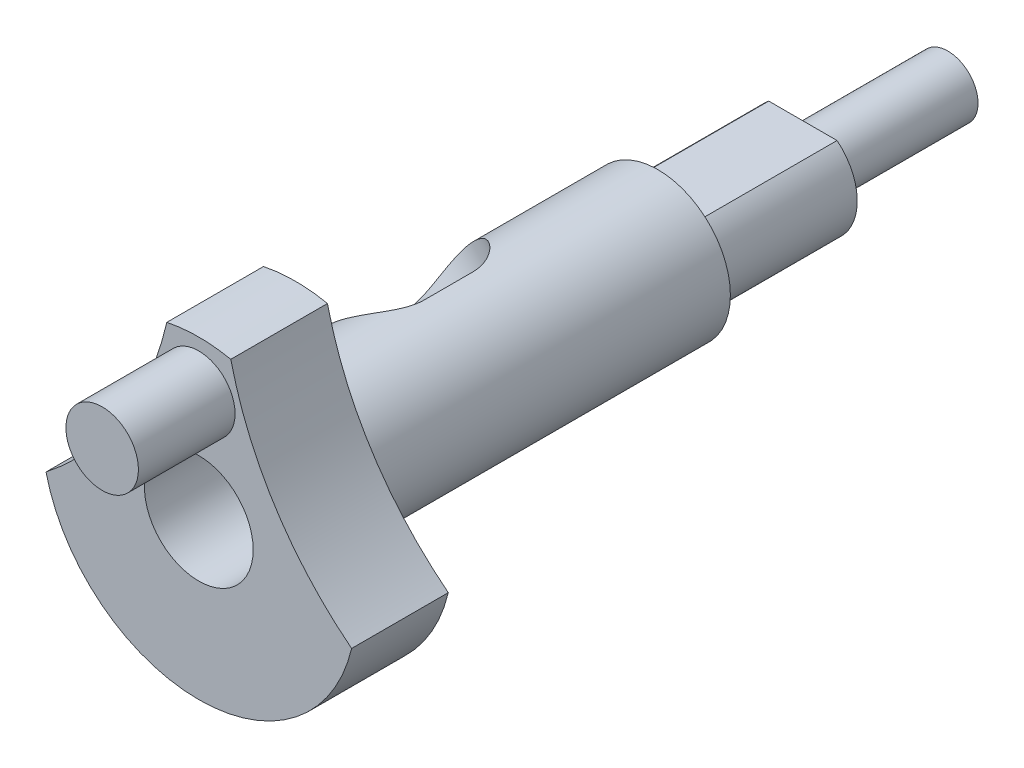
ISO-10303-21;
HEADER;
FILE_DESCRIPTION(('STEP AP214'),'2;1');
FILE_NAME('part.step','',(''),(''),'','','');
FILE_SCHEMA(('AUTOMOTIVE_DESIGN { 1 0 10303 214 1 1 1 1 }'));
ENDSEC;
DATA;
#1=APPLICATION_CONTEXT('core data for automotive mechanical design processes');
#2=APPLICATION_PROTOCOL_DEFINITION('international standard','automotive_design',2000,#1);
#3=PRODUCT_CONTEXT('',#1,'mechanical');
#4=PRODUCT('Part','Part','',(#3));
#5=PRODUCT_RELATED_PRODUCT_CATEGORY('part','',(#4));
#6=PRODUCT_DEFINITION_FORMATION('','',#4);
#7=PRODUCT_DEFINITION_CONTEXT('part definition',#1,'design');
#8=PRODUCT_DEFINITION('design','',#6,#7);
#9=PRODUCT_DEFINITION_SHAPE('','',#8);
#10=(LENGTH_UNIT() NAMED_UNIT(*) SI_UNIT(.MILLI.,.METRE.));
#11=(NAMED_UNIT(*) PLANE_ANGLE_UNIT() SI_UNIT($,.RADIAN.));
#12=(NAMED_UNIT(*) SI_UNIT($,.STERADIAN.) SOLID_ANGLE_UNIT());
#13=UNCERTAINTY_MEASURE_WITH_UNIT(LENGTH_MEASURE(1.E-05),#10,'distance_accuracy_value','');
#14=(GEOMETRIC_REPRESENTATION_CONTEXT(3) GLOBAL_UNCERTAINTY_ASSIGNED_CONTEXT((#13)) GLOBAL_UNIT_ASSIGNED_CONTEXT((#10,
#11,#12)) REPRESENTATION_CONTEXT('',''));
#15=CARTESIAN_POINT('',(0.,0.,0.));
#16=DIRECTION('',(0.,0.,1.));
#17=DIRECTION('',(1.,0.,0.));
#18=AXIS2_PLACEMENT_3D('',#15,#16,#17);
#19=CARTESIAN_POINT('',(0.,0.,38.));
#20=DIRECTION('',(0.,0.,-1.));
#21=DIRECTION('',(-1.,0.,0.));
#22=AXIS2_PLACEMENT_3D('',#19,#20,#21);
#23=CYLINDRICAL_SURFACE('',#22,6.);
#24=DIRECTION('',(0.,0.,-1.));
#25=VECTOR('',#24,1.);
#26=CARTESIAN_POINT('',(-5.99070478491457,0.333850535422231,38.));
#27=LINE('',#26,#25);
#28=CARTESIAN_POINT('',(-5.99070478491457,0.333850535422226,19.));
#29=VERTEX_POINT('',#28);
#30=CARTESIAN_POINT('',(-5.99070478491457,0.333850535422219,15.));
#31=VERTEX_POINT('',#30);
#32=EDGE_CURVE('E181',#29,#31,#27,.T.);
#33=ORIENTED_EDGE('',*,*,#32,.T.);
#34=CARTESIAN_POINT('',(-5.99070478491457,0.33385053542222,15.));
#35=CARTESIAN_POINT('',(-5.99068462384601,0.333794102484212,14.9016700694421));
#36=CARTESIAN_POINT('',(-5.99043392835748,0.338705679734013,14.803373809837));
#37=CARTESIAN_POINT('',(-5.98932261966602,0.358024435349374,14.6078499824939));
#38=CARTESIAN_POINT('',(-5.98846282369383,0.372418888719368,14.5106211598811));
#39=CARTESIAN_POINT('',(-5.98599743490155,0.410078400866928,14.3189160856903));
#40=CARTESIAN_POINT('',(-5.98439928518992,0.433254524490413,14.2244221397863));
#41=CARTESIAN_POINT('',(-5.98020314310197,0.487771412282417,14.0378468270955));
#42=CARTESIAN_POINT('',(-5.97760485980892,0.519114551197127,13.9457661706127));
#43=CARTESIAN_POINT('',(-5.96789076651244,0.623838637610835,13.6748967950068));
#44=CARTESIAN_POINT('',(-5.95884794145704,0.708157436176512,13.5003249059518));
#45=CARTESIAN_POINT('',(-5.93292407085201,0.899871896742307,13.164660993962));
#46=CARTESIAN_POINT('',(-5.91602063294133,1.00733301111156,13.003609042524));
#47=CARTESIAN_POINT('',(-5.86825416594927,1.25788232981635,12.6726721668229));
#48=CARTESIAN_POINT('',(-5.83563828537548,1.40390968032932,12.5052649498398));
#49=CARTESIAN_POINT('',(-5.75247114126858,1.71309527713194,12.1918872762063));
#50=CARTESIAN_POINT('',(-5.70191251112702,1.87626054019438,12.0459256591567));
#51=CARTESIAN_POINT('',(-5.60567811837211,2.14172586596341,11.8353387691972));
#52=CARTESIAN_POINT('',(-5.56713283544842,2.24027143049692,11.7625927007597));
#53=CARTESIAN_POINT('',(-5.4825252168611,2.44001242225565,11.6256347561315));
#54=CARTESIAN_POINT('',(-5.43646608759882,2.54120670379065,11.5614192607838));
#55=CARTESIAN_POINT('',(-5.33642982206874,2.74506927496129,11.4422602153109));
#56=CARTESIAN_POINT('',(-5.28245643410357,2.84773684617436,11.3873123022751));
#57=CARTESIAN_POINT('',(-5.16633968155836,3.05333591547656,11.2874500802822));
#58=CARTESIAN_POINT('',(-5.10419807251795,3.15626735220721,11.2425336209168));
#59=CARTESIAN_POINT('',(-4.97918147802601,3.34954870284617,11.1679527379798));
#60=CARTESIAN_POINT('',(-4.91716969499483,3.44001545956048,11.1371429666341));
#61=CARTESIAN_POINT('',(-4.78692038727476,3.61906632763843,11.084556090231));
#62=CARTESIAN_POINT('',(-4.7186840853636,3.70765080456955,11.0627772157379));
#63=CARTESIAN_POINT('',(-4.57646107465812,3.88183379595727,11.0286602692173));
#64=CARTESIAN_POINT('',(-4.50248013883438,3.9674351859929,11.0163128510814));
#65=CARTESIAN_POINT('',(-4.34933158770849,4.13475150400611,11.0012670175454));
#66=CARTESIAN_POINT('',(-4.27016470582344,4.21646697873617,10.9985672407247));
#67=CARTESIAN_POINT('',(-4.11986475751268,4.36302616137143,11.0025359831951));
#68=CARTESIAN_POINT('',(-4.04934667428559,4.42854291014055,11.0078391464272));
#69=CARTESIAN_POINT('',(-3.90570457662103,4.55572999286147,11.0253326644031));
#70=CARTESIAN_POINT('',(-3.83257980541936,4.61739919527942,11.0375250347069));
#71=CARTESIAN_POINT('',(-3.68437622852754,4.73649689078476,11.0686276380302));
#72=CARTESIAN_POINT('',(-3.60929809605171,4.79392681940027,11.0875355842599));
#73=CARTESIAN_POINT('',(-3.45777879317312,4.90434231773574,11.1318208891128));
#74=CARTESIAN_POINT('',(-3.38133710491112,4.95732615335596,11.1572007565209));
#75=CARTESIAN_POINT('',(-3.1515803017739,5.10891450582079,11.2423705436646));
#76=CARTESIAN_POINT('',(-2.99708244893249,5.20075288103304,11.3113512975243));
#77=CARTESIAN_POINT('',(-2.68981265509196,5.36613995064513,11.4711137268256));
#78=CARTESIAN_POINT('',(-2.53704103484302,5.43968529768881,11.5618993862802));
#79=CARTESIAN_POINT('',(-2.21735018226009,5.57830992876048,11.7759534369368));
#80=CARTESIAN_POINT('',(-2.05121030998877,5.64100629163019,11.901922758987));
#81=CARTESIAN_POINT('',(-1.73099638294765,5.7473611340493,12.1758175657317));
#82=CARTESIAN_POINT('',(-1.57694114843918,5.79099038376687,12.3237762981113));
#83=CARTESIAN_POINT('',(-1.34787815689185,5.84728203701133,12.5727700828312));
#84=CARTESIAN_POINT('',(-1.26694706940593,5.86524278605991,12.6672579482261));
#85=CARTESIAN_POINT('',(-1.1121464587109,5.89655614056708,12.8625720649592));
#86=CARTESIAN_POINT('',(-1.03827858805236,5.90990766952429,12.9633997905053));
#87=CARTESIAN_POINT('',(-0.829423409196999,5.94406029413866,13.2747973576292));
#88=CARTESIAN_POINT('',(-0.706770717927883,5.95905148321317,13.4947201963963));
#89=CARTESIAN_POINT('',(-0.53587236557008,5.97646414038617,13.8907212733341));
#90=CARTESIAN_POINT('',(-0.476409046988667,5.9812295733466,14.0618387549338));
#91=CARTESIAN_POINT('',(-0.409191403767886,5.98607049220323,14.3238865733191));
#92=CARTESIAN_POINT('',(-0.390456555168995,5.98729950957404,14.4120361908501));
#93=CARTESIAN_POINT('',(-0.360741262689207,5.98916498689055,14.5896181690323));
#94=CARTESIAN_POINT('',(-0.349755973150613,5.9898018171994,14.6790496923692));
#95=CARTESIAN_POINT('',(-0.339824020492703,5.99036941518117,14.8072383792669));
#96=CARTESIAN_POINT('',(-0.33758504877755,5.99049570796023,14.8457629168698));
#97=CARTESIAN_POINT('',(-0.334598422532334,5.99066322707905,14.9228564849096));
#98=CARTESIAN_POINT('',(-0.333850249468071,5.99070448299677,14.9614254952058));
#99=CARTESIAN_POINT('',(-0.333850535422159,5.99070478491457,15.));
#100=B_SPLINE_CURVE_WITH_KNOTS('',3,(#34,#35,#36,#37,#38,#39,#40,#41,#42,#43,#44,#45,#46,#47,
#48,#49,#50,#51,#52,#53,#54,#55,#56,#57,#58,#59,#60,#61,#62,#63,#64,#65,#66,#67,#68,#69,#70,#71,
#72,#73,#74,#75,#76,#77,#78,#79,#80,#81,#82,#83,#84,#85,#86,#87,#88,#89,#90,#91,#92,#93,#94,#95,
#96,#97,#98,#99),.UNSPECIFIED.,.F.,.F.,(4,2,2,2,2,2,2,2,2,2,2,2,2,2,2,2,2,2,2,2,2,2,2,2,2,2,2,2,
2,2,2,2,4),(0.,0.294812601374015,0.589230399700308,0.88074293705704,1.17234033311452,
1.75203722892106,2.33339570715297,3.00454638680601,3.67597293470638,4.06075015246325,
4.44536360079123,4.82979547572238,5.21414486203719,5.55540621902153,5.89660068058384,
6.23745659503621,6.57826440792967,6.86711986515746,7.15605987596875,7.4449015910287,
7.73385544376988,8.30887925814426,8.88400821617185,9.53472255750196,10.1864309725428,
10.563119297333,10.9398955397299,11.6916405518195,12.2329415710687,12.5030281277052,
12.7729456541035,12.8886912839471,13.004396647755),.UNSPECIFIED.);
#101=CARTESIAN_POINT('',(-0.333850535422156,5.99070478491457,15.));
#102=VERTEX_POINT('',#101);
#103=EDGE_CURVE('E257',#31,#102,#100,.T.);
#104=ORIENTED_EDGE('',*,*,#103,.T.);
#105=DIRECTION('',(0.,0.,-1.));
#106=VECTOR('',#105,1.);
#107=CARTESIAN_POINT('',(-0.333850535422155,5.99070478491457,38.));
#108=LINE('',#107,#106);
#109=CARTESIAN_POINT('',(-0.333850535422155,5.99070478491457,19.));
#110=VERTEX_POINT('',#109);
#111=EDGE_CURVE('E358',#102,#110,#108,.F.);
#112=ORIENTED_EDGE('',*,*,#111,.T.);
#113=CARTESIAN_POINT('',(-0.333850535422159,5.99070478491457,19.));
#114=CARTESIAN_POINT('',(-0.333794102484151,5.99068462384602,19.098329930558));
#115=CARTESIAN_POINT('',(-0.338705679733952,5.99043392835748,19.196626190163));
#116=CARTESIAN_POINT('',(-0.358024435349313,5.98932261966602,19.3921500175061));
#117=CARTESIAN_POINT('',(-0.372418888719307,5.98846282369383,19.489378840119));
#118=CARTESIAN_POINT('',(-0.410078400866868,5.98599743490155,19.6810839143097));
#119=CARTESIAN_POINT('',(-0.433254524490353,5.98439928518993,19.7755778602137));
#120=CARTESIAN_POINT('',(-0.487771412282356,5.98020314310197,19.9621531729045));
#121=CARTESIAN_POINT('',(-0.519114551197065,5.97760485980892,20.0542338293873));
#122=CARTESIAN_POINT('',(-0.623838637610773,5.96789076651244,20.3251032049932));
#123=CARTESIAN_POINT('',(-0.70815743617645,5.95884794145705,20.4996750940482));
#124=CARTESIAN_POINT('',(-0.899871896742246,5.93292407085202,20.835339006038));
#125=CARTESIAN_POINT('',(-1.0073330111115,5.91602063294134,20.996390957476));
#126=CARTESIAN_POINT('',(-1.25788232981629,5.86825416594928,21.3273278331771));
#127=CARTESIAN_POINT('',(-1.40390968032926,5.83563828537549,21.4947350501602));
#128=CARTESIAN_POINT('',(-1.71309527713188,5.7524711412686,21.8081127237937));
#129=CARTESIAN_POINT('',(-1.87626054019432,5.70191251112704,21.9540743408433));
#130=CARTESIAN_POINT('',(-2.14172586596335,5.60567811837214,22.1646612308028));
#131=CARTESIAN_POINT('',(-2.24027143049686,5.56713283544844,22.2374072992403));
#132=CARTESIAN_POINT('',(-2.4400124222556,5.48252521686113,22.3743652438686));
#133=CARTESIAN_POINT('',(-2.54120670379059,5.43646608759884,22.4385807392162));
#134=CARTESIAN_POINT('',(-2.74506927496124,5.33642982206877,22.5577397846892));
#135=CARTESIAN_POINT('',(-2.8477368461743,5.2824564341036,22.612687697725));
#136=CARTESIAN_POINT('',(-3.05333591547651,5.1663396815584,22.7125499197178));
#137=CARTESIAN_POINT('',(-3.15626735220716,5.10419807251798,22.7574663790832));
#138=CARTESIAN_POINT('',(-3.34954870284612,4.97918147802605,22.8320472620202));
#139=CARTESIAN_POINT('',(-3.44001545956042,4.91716969499487,22.8628570333659));
#140=CARTESIAN_POINT('',(-3.61906632763837,4.7869203872748,22.915443909769));
#141=CARTESIAN_POINT('',(-3.7076508045695,4.71868408536364,22.9372227842621));
#142=CARTESIAN_POINT('',(-3.88183379595722,4.57646107465816,22.9713397307827));
#143=CARTESIAN_POINT('',(-3.96743518599285,4.50248013883443,22.9836871489186));
#144=CARTESIAN_POINT('',(-4.13475150400607,4.34933158770854,22.9987329824546));
#145=CARTESIAN_POINT('',(-4.21646697873612,4.27016470582349,23.0014327592753));
#146=CARTESIAN_POINT('',(-4.36302616137139,4.11986475751273,22.9974640168049));
#147=CARTESIAN_POINT('',(-4.42854291014051,4.04934667428564,22.9921608535728));
#148=CARTESIAN_POINT('',(-4.55572999286143,3.90570457662107,22.9746673355969));
#149=CARTESIAN_POINT('',(-4.61739919527938,3.83257980541941,22.9624749652931));
#150=CARTESIAN_POINT('',(-4.73649689078472,3.68437622852759,22.9313723619698));
#151=CARTESIAN_POINT('',(-4.79392681940023,3.60929809605176,22.9124644157401));
#152=CARTESIAN_POINT('',(-4.9043423177357,3.45777879317317,22.8681791108872));
#153=CARTESIAN_POINT('',(-4.95732615335593,3.38133710491117,22.8427992434791));
#154=CARTESIAN_POINT('',(-5.10891450582076,3.15158030177396,22.7576294563355));
#155=CARTESIAN_POINT('',(-5.20075288103301,2.99708244893255,22.6886487024757));
#156=CARTESIAN_POINT('',(-5.3661399506451,2.68981265509202,22.5288862731744));
#157=CARTESIAN_POINT('',(-5.43968529768879,2.53704103484308,22.4381006137198));
#158=CARTESIAN_POINT('',(-5.57830992876045,2.21735018226015,22.2240465630632));
#159=CARTESIAN_POINT('',(-5.64100629163017,2.05121030998883,22.098077241013));
#160=CARTESIAN_POINT('',(-5.74736113404928,1.73099638294771,21.8241824342683));
#161=CARTESIAN_POINT('',(-5.79099038376686,1.57694114843924,21.6762237018887));
#162=CARTESIAN_POINT('',(-5.84728203701131,1.34787815689192,21.4272299171688));
#163=CARTESIAN_POINT('',(-5.86524278605989,1.26694706940599,21.3327420517739));
#164=CARTESIAN_POINT('',(-5.89655614056707,1.11214645871096,21.1374279350408));
#165=CARTESIAN_POINT('',(-5.90990766952428,1.03827858805242,21.0366002094948));
#166=CARTESIAN_POINT('',(-5.94406029413865,0.829423409197063,20.7252026423708));
#167=CARTESIAN_POINT('',(-5.95905148321316,0.706770717927947,20.5052798036037));
#168=CARTESIAN_POINT('',(-5.97646414038616,0.535872365570145,20.1092787266659));
#169=CARTESIAN_POINT('',(-5.98122957334659,0.476409046988732,19.9381612450662));
#170=CARTESIAN_POINT('',(-5.98607049220323,0.40919140376795,19.6761134266809));
#171=CARTESIAN_POINT('',(-5.98729950957404,0.390456555169059,19.5879638091499));
#172=CARTESIAN_POINT('',(-5.98916498689055,0.360741262689271,19.4103818309677));
#173=CARTESIAN_POINT('',(-5.9898018171994,0.349755973150676,19.3209503076308));
#174=CARTESIAN_POINT('',(-5.99036941518117,0.339824020492767,19.1927616207331));
#175=CARTESIAN_POINT('',(-5.99049570796022,0.337585048777614,19.1542370831302));
#176=CARTESIAN_POINT('',(-5.99066322707904,0.334598422532398,19.0771435150904));
#177=CARTESIAN_POINT('',(-5.99070448299677,0.333850249468135,19.0385745047942));
#178=CARTESIAN_POINT('',(-5.99070478491457,0.333850535422222,19.));
#179=B_SPLINE_CURVE_WITH_KNOTS('',3,(#113,#114,#115,#116,#117,#118,#119,#120,#121,#122,#123,
#124,#125,#126,#127,#128,#129,#130,#131,#132,#133,#134,#135,#136,#137,#138,#139,#140,#141,#142,
#143,#144,#145,#146,#147,#148,#149,#150,#151,#152,#153,#154,#155,#156,#157,#158,#159,#160,#161,
#162,#163,#164,#165,#166,#167,#168,#169,#170,#171,#172,#173,#174,#175,#176,#177,#178),
.UNSPECIFIED.,.F.,.F.,(4,2,2,2,2,2,2,2,2,2,2,2,2,2,2,2,2,2,2,2,2,2,2,2,2,2,2,2,2,2,2,2,4),(0.,
0.294812601374016,0.589230399700311,0.88074293705704,1.17234033311452,1.75203722892105,
2.33339570715297,3.00454638680601,3.67597293470638,4.06075015246325,4.44536360079123,
4.82979547572238,5.21414486203718,5.55540621902153,5.89660068058383,6.23745659503621,
6.57826440792966,6.86711986515746,7.15605987596875,7.4449015910287,7.73385544376987,
8.30887925814425,8.88400821617184,9.53472255750196,10.1864309725428,10.563119297333,
10.9398955397299,11.6916405518195,12.2329415710687,12.5030281277052,12.7729456541035,
12.8886912839471,13.004396647755),.UNSPECIFIED.);
#180=EDGE_CURVE('E173',#110,#29,#179,.T.);
#181=ORIENTED_EDGE('',*,*,#180,.T.);
#182=EDGE_LOOP('',(#33,#104,#112,#181));
#183=FACE_BOUND('',#182,.T.);
#184=CARTESIAN_POINT('',(0.,0.,0.));
#185=DIRECTION('',(0.,0.,1.));
#186=DIRECTION('',(1.,0.,0.));
#187=AXIS2_PLACEMENT_3D('',#184,#185,#186);
#188=CIRCLE('',#187,6.);
#189=CARTESIAN_POINT('',(6.,0.,0.));
#190=VERTEX_POINT('',#189);
#191=EDGE_CURVE('E138',#190,#190,#188,.T.);
#192=ORIENTED_EDGE('',*,*,#191,.T.);
#193=EDGE_LOOP('',(#192));
#194=FACE_BOUND('',#193,.T.);
#195=CARTESIAN_POINT('',(0.,0.,30.));
#196=DIRECTION('',(0.,0.,1.));
#197=DIRECTION('',(1.,0.,0.));
#198=AXIS2_PLACEMENT_3D('',#195,#196,#197);
#199=CIRCLE('',#198,6.);
#200=CARTESIAN_POINT('',(6.,0.,30.));
#201=VERTEX_POINT('',#200);
#202=EDGE_CURVE('E137',#201,#201,#199,.T.);
#203=ORIENTED_EDGE('',*,*,#202,.F.);
#204=EDGE_LOOP('',(#203));
#205=FACE_BOUND('',#204,.T.);
#206=ADVANCED_FACE('F43',(#183,#194,#205),#23,.T.);
#207=CARTESIAN_POINT('',(0.,0.,0.));
#208=DIRECTION('',(0.,0.,1.));
#209=DIRECTION('',(1.,0.,0.));
#210=AXIS2_PLACEMENT_3D('',#207,#208,#209);
#211=PLANE('',#210);
#212=DIRECTION('',(1.,0.,0.));
#213=VECTOR('',#212,1.);
#214=CARTESIAN_POINT('',(-3.5,3.5,0.));
#215=LINE('',#214,#213);
#216=CARTESIAN_POINT('',(-2.82842712474619,3.5,0.));
#217=VERTEX_POINT('',#216);
#218=CARTESIAN_POINT('',(2.82842712474619,3.5,0.));
#219=VERTEX_POINT('',#218);
#220=EDGE_CURVE('E124',#217,#219,#215,.T.);
#221=ORIENTED_EDGE('',*,*,#220,.F.);
#222=CARTESIAN_POINT('',(0.,0.,0.));
#223=DIRECTION('',(0.,0.,1.));
#224=DIRECTION('',(1.,0.,0.));
#225=AXIS2_PLACEMENT_3D('',#222,#223,#224);
#226=CIRCLE('',#225,4.5);
#227=EDGE_CURVE('E134',#219,#217,#226,.F.);
#228=ORIENTED_EDGE('',*,*,#227,.F.);
#229=EDGE_LOOP('',(#221,#228));
#230=FACE_BOUND('',#229,.T.);
#231=ORIENTED_EDGE('',*,*,#191,.F.);
#232=EDGE_LOOP('',(#231));
#233=FACE_BOUND('',#232,.T.);
#234=ADVANCED_FACE('F132',(#230,#233),#211,.F.);
#235=CARTESIAN_POINT('',(0.,0.,-12.));
#236=DIRECTION('',(0.,0.,1.));
#237=DIRECTION('',(1.,0.,0.));
#238=AXIS2_PLACEMENT_3D('',#235,#236,#237);
#239=CYLINDRICAL_SURFACE('',#238,4.5);
#240=CARTESIAN_POINT('',(0.,0.,-12.));
#241=DIRECTION('',(0.,0.,-1.));
#242=DIRECTION('',(-1.,0.,0.));
#243=AXIS2_PLACEMENT_3D('',#240,#241,#242);
#244=CIRCLE('',#243,4.5);
#245=CARTESIAN_POINT('',(2.82842712474619,3.5,-12.));
#246=VERTEX_POINT('',#245);
#247=CARTESIAN_POINT('',(-2.82842712474619,3.5,-12.));
#248=VERTEX_POINT('',#247);
#249=EDGE_CURVE('E144',#246,#248,#244,.T.);
#250=ORIENTED_EDGE('',*,*,#249,.F.);
#251=DIRECTION('',(0.,0.,1.));
#252=VECTOR('',#251,1.);
#253=CARTESIAN_POINT('',(2.82842712474619,3.5,-12.));
#254=LINE('',#253,#252);
#255=EDGE_CURVE('E57',#246,#219,#254,.T.);
#256=ORIENTED_EDGE('',*,*,#255,.T.);
#257=ORIENTED_EDGE('',*,*,#227,.T.);
#258=DIRECTION('',(0.,0.,1.));
#259=VECTOR('',#258,1.);
#260=CARTESIAN_POINT('',(-2.82842712474619,3.5,-12.));
#261=LINE('',#260,#259);
#262=EDGE_CURVE('E121',#217,#248,#261,.F.);
#263=ORIENTED_EDGE('',*,*,#262,.T.);
#264=EDGE_LOOP('',(#250,#256,#257,#263));
#265=FACE_BOUND('',#264,.T.);
#266=ADVANCED_FACE('F136',(#265),#239,.T.);
#267=CARTESIAN_POINT('',(0.,0.,-12.));
#268=DIRECTION('',(0.,0.,-1.));
#269=DIRECTION('',(-1.,0.,0.));
#270=AXIS2_PLACEMENT_3D('',#267,#268,#269);
#271=PLANE('',#270);
#272=DIRECTION('',(-1.,0.,0.));
#273=VECTOR('',#272,1.);
#274=CARTESIAN_POINT('',(0.,3.5,-12.));
#275=LINE('',#274,#273);
#276=EDGE_CURVE('E11',#246,#248,#275,.T.);
#277=ORIENTED_EDGE('',*,*,#276,.F.);
#278=ORIENTED_EDGE('',*,*,#249,.T.);
#279=EDGE_LOOP('',(#277,#278));
#280=FACE_BOUND('',#279,.T.);
#281=CARTESIAN_POINT('',(0.,0.,-12.));
#282=DIRECTION('',(0.,0.,-1.));
#283=DIRECTION('',(-1.,0.,0.));
#284=AXIS2_PLACEMENT_3D('',#281,#282,#283);
#285=CIRCLE('',#284,2.5);
#286=CARTESIAN_POINT('',(-2.5,0.,-12.));
#287=VERTEX_POINT('',#286);
#288=EDGE_CURVE('E231',#287,#287,#285,.T.);
#289=ORIENTED_EDGE('',*,*,#288,.F.);
#290=EDGE_LOOP('',(#289));
#291=FACE_BOUND('',#290,.T.);
#292=ADVANCED_FACE('F224',(#280,#291),#271,.T.);
#293=CARTESIAN_POINT('',(-29.9303086058866,19.0308918767969,30.));
#294=DIRECTION('',(0.,0.,1.));
#295=DIRECTION('',(1.,0.,0.));
#296=AXIS2_PLACEMENT_3D('',#293,#294,#295);
#297=CYLINDRICAL_SURFACE('',#296,28.);
#298=CARTESIAN_POINT('',(-29.9303086058866,19.0308918767969,38.));
#299=DIRECTION('',(0.,0.,1.));
#300=DIRECTION('',(1.,0.,0.));
#301=AXIS2_PLACEMENT_3D('',#298,#299,#300);
#302=CIRCLE('',#301,28.);
#303=CARTESIAN_POINT('',(-12.6491106406735,-3.,38.));
#304=VERTEX_POINT('',#303);
#305=CARTESIAN_POINT('',(-2.64911064067352,12.7272232954981,38.));
#306=VERTEX_POINT('',#305);
#307=EDGE_CURVE('E192',#304,#306,#302,.T.);
#308=ORIENTED_EDGE('',*,*,#307,.T.);
#309=DIRECTION('',(0.,0.,1.));
#310=VECTOR('',#309,1.);
#311=CARTESIAN_POINT('',(-2.64911064067352,12.7272232954981,30.));
#312=LINE('',#311,#310);
#313=CARTESIAN_POINT('',(-2.64911064067352,12.7272232954981,30.));
#314=VERTEX_POINT('',#313);
#315=EDGE_CURVE('E222',#314,#306,#312,.T.);
#316=ORIENTED_EDGE('',*,*,#315,.F.);
#317=CARTESIAN_POINT('',(-29.9303086058866,19.0308918767969,30.));
#318=DIRECTION('',(0.,0.,1.));
#319=DIRECTION('',(1.,0.,0.));
#320=AXIS2_PLACEMENT_3D('',#317,#318,#319);
#321=CIRCLE('',#320,28.);
#322=CARTESIAN_POINT('',(-12.6491106406735,-3.,30.));
#323=VERTEX_POINT('',#322);
#324=EDGE_CURVE('E195',#323,#314,#321,.T.);
#325=ORIENTED_EDGE('',*,*,#324,.F.);
#326=DIRECTION('',(0.,0.,1.));
#327=VECTOR('',#326,1.);
#328=CARTESIAN_POINT('',(-12.6491106406735,-3.,30.));
#329=LINE('',#328,#327);
#330=EDGE_CURVE('E206',#323,#304,#329,.T.);
#331=ORIENTED_EDGE('',*,*,#330,.T.);
#332=EDGE_LOOP('',(#308,#316,#325,#331));
#333=FACE_BOUND('',#332,.T.);
#334=ADVANCED_FACE('F227',(#333),#297,.F.);
#335=CARTESIAN_POINT('',(0.,0.,30.));
#336=DIRECTION('',(0.,0.,1.));
#337=DIRECTION('',(1.,0.,0.));
#338=AXIS2_PLACEMENT_3D('',#335,#336,#337);
#339=CYLINDRICAL_SURFACE('',#338,13.);
#340=CARTESIAN_POINT('',(0.,0.,38.));
#341=DIRECTION('',(0.,0.,1.));
#342=DIRECTION('',(1.,0.,0.));
#343=AXIS2_PLACEMENT_3D('',#340,#341,#342);
#344=CIRCLE('',#343,13.);
#345=CARTESIAN_POINT('',(2.64911064067352,12.7272232954981,38.));
#346=VERTEX_POINT('',#345);
#347=EDGE_CURVE('E209',#346,#306,#344,.T.);
#348=ORIENTED_EDGE('',*,*,#347,.F.);
#349=DIRECTION('',(0.,0.,1.));
#350=VECTOR('',#349,1.);
#351=CARTESIAN_POINT('',(2.64911064067352,12.7272232954981,30.));
#352=LINE('',#351,#350);
#353=CARTESIAN_POINT('',(2.64911064067352,12.7272232954981,30.));
#354=VERTEX_POINT('',#353);
#355=EDGE_CURVE('E220',#354,#346,#352,.T.);
#356=ORIENTED_EDGE('',*,*,#355,.F.);
#357=CARTESIAN_POINT('',(0.,0.,30.));
#358=DIRECTION('',(0.,0.,1.));
#359=DIRECTION('',(1.,0.,0.));
#360=AXIS2_PLACEMENT_3D('',#357,#358,#359);
#361=CIRCLE('',#360,13.);
#362=EDGE_CURVE('E197',#354,#314,#361,.T.);
#363=ORIENTED_EDGE('',*,*,#362,.T.);
#364=ORIENTED_EDGE('',*,*,#315,.T.);
#365=EDGE_LOOP('',(#348,#356,#363,#364));
#366=FACE_BOUND('',#365,.T.);
#367=ADVANCED_FACE('F310',(#366),#339,.T.);
#368=CARTESIAN_POINT('',(29.9303086058866,19.0308918767969,30.));
#369=DIRECTION('',(0.,0.,1.));
#370=DIRECTION('',(1.,0.,0.));
#371=AXIS2_PLACEMENT_3D('',#368,#369,#370);
#372=CYLINDRICAL_SURFACE('',#371,28.);
#373=CARTESIAN_POINT('',(29.9303086058866,19.0308918767969,38.));
#374=DIRECTION('',(0.,0.,1.));
#375=DIRECTION('',(1.,0.,0.));
#376=AXIS2_PLACEMENT_3D('',#373,#374,#375);
#377=CIRCLE('',#376,28.);
#378=CARTESIAN_POINT('',(12.6491106406735,-3.,38.));
#379=VERTEX_POINT('',#378);
#380=EDGE_CURVE('E212',#346,#379,#377,.T.);
#381=ORIENTED_EDGE('',*,*,#380,.T.);
#382=DIRECTION('',(0.,0.,1.));
#383=VECTOR('',#382,1.);
#384=CARTESIAN_POINT('',(12.6491106406735,-3.,30.));
#385=LINE('',#384,#383);
#386=CARTESIAN_POINT('',(12.6491106406735,-3.,30.));
#387=VERTEX_POINT('',#386);
#388=EDGE_CURVE('E218',#387,#379,#385,.T.);
#389=ORIENTED_EDGE('',*,*,#388,.F.);
#390=CARTESIAN_POINT('',(29.9303086058866,19.0308918767969,30.));
#391=DIRECTION('',(0.,0.,1.));
#392=DIRECTION('',(1.,0.,0.));
#393=AXIS2_PLACEMENT_3D('',#390,#391,#392);
#394=CIRCLE('',#393,28.);
#395=EDGE_CURVE('E201',#354,#387,#394,.T.);
#396=ORIENTED_EDGE('',*,*,#395,.F.);
#397=ORIENTED_EDGE('',*,*,#355,.T.);
#398=EDGE_LOOP('',(#381,#389,#396,#397));
#399=FACE_BOUND('',#398,.T.);
#400=ADVANCED_FACE('F315',(#399),#372,.F.);
#401=CARTESIAN_POINT('',(0.,0.,30.));
#402=DIRECTION('',(0.,0.,1.));
#403=DIRECTION('',(1.,0.,0.));
#404=AXIS2_PLACEMENT_3D('',#401,#402,#403);
#405=CYLINDRICAL_SURFACE('',#404,13.);
#406=CARTESIAN_POINT('',(0.,0.,38.));
#407=DIRECTION('',(0.,0.,1.));
#408=DIRECTION('',(1.,0.,0.));
#409=AXIS2_PLACEMENT_3D('',#406,#407,#408);
#410=CIRCLE('',#409,13.);
#411=EDGE_CURVE('E198',#304,#379,#410,.T.);
#412=ORIENTED_EDGE('',*,*,#411,.F.);
#413=ORIENTED_EDGE('',*,*,#330,.F.);
#414=CARTESIAN_POINT('',(0.,0.,30.));
#415=DIRECTION('',(0.,0.,1.));
#416=DIRECTION('',(1.,0.,0.));
#417=AXIS2_PLACEMENT_3D('',#414,#415,#416);
#418=CIRCLE('',#417,13.);
#419=EDGE_CURVE('E203',#323,#387,#418,.T.);
#420=ORIENTED_EDGE('',*,*,#419,.T.);
#421=ORIENTED_EDGE('',*,*,#388,.T.);
#422=EDGE_LOOP('',(#412,#413,#420,#421));
#423=FACE_BOUND('',#422,.T.);
#424=ADVANCED_FACE('F300',(#423),#405,.T.);
#425=CARTESIAN_POINT('',(-14.9651543029433,9.51544593839844,30.));
#426=DIRECTION('',(0.,0.,1.));
#427=DIRECTION('',(1.,0.,0.));
#428=AXIS2_PLACEMENT_3D('',#425,#426,#427);
#429=PLANE('',#428);
#430=ORIENTED_EDGE('',*,*,#202,.T.);
#431=EDGE_LOOP('',(#430));
#432=FACE_BOUND('',#431,.T.);
#433=ORIENTED_EDGE('',*,*,#324,.T.);
#434=ORIENTED_EDGE('',*,*,#362,.F.);
#435=ORIENTED_EDGE('',*,*,#395,.T.);
#436=ORIENTED_EDGE('',*,*,#419,.F.);
#437=EDGE_LOOP('',(#433,#434,#435,#436));
#438=FACE_BOUND('',#437,.T.);
#439=ADVANCED_FACE('F296',(#432,#438),#429,.F.);
#440=CARTESIAN_POINT('',(0.,0.,38.));
#441=DIRECTION('',(0.,0.,1.));
#442=DIRECTION('',(1.,0.,0.));
#443=AXIS2_PLACEMENT_3D('',#440,#441,#442);
#444=PLANE('',#443);
#445=CARTESIAN_POINT('',(0.,0.,38.));
#446=DIRECTION('',(0.,0.,1.));
#447=DIRECTION('',(1.,0.,0.));
#448=AXIS2_PLACEMENT_3D('',#445,#446,#447);
#449=CIRCLE('',#448,4.5);
#450=CARTESIAN_POINT('',(4.5,0.,38.));
#451=VERTEX_POINT('',#450);
#452=EDGE_CURVE('E180',#451,#451,#449,.T.);
#453=ORIENTED_EDGE('',*,*,#452,.F.);
#454=EDGE_LOOP('',(#453));
#455=FACE_BOUND('',#454,.T.);
#456=CARTESIAN_POINT('',(0.,9.,38.));
#457=DIRECTION('',(0.,0.,1.));
#458=DIRECTION('',(1.,0.,0.));
#459=AXIS2_PLACEMENT_3D('',#456,#457,#458);
#460=CIRCLE('',#459,3.);
#461=CARTESIAN_POINT('',(3.,9.,38.));
#462=VERTEX_POINT('',#461);
#463=EDGE_CURVE('E186',#462,#462,#460,.T.);
#464=ORIENTED_EDGE('',*,*,#463,.F.);
#465=EDGE_LOOP('',(#464));
#466=FACE_BOUND('',#465,.T.);
#467=ORIENTED_EDGE('',*,*,#307,.F.);
#468=ORIENTED_EDGE('',*,*,#411,.T.);
#469=ORIENTED_EDGE('',*,*,#380,.F.);
#470=ORIENTED_EDGE('',*,*,#347,.T.);
#471=EDGE_LOOP('',(#467,#468,#469,#470));
#472=FACE_BOUND('',#471,.T.);
#473=ADVANCED_FACE('F299',(#455,#466,#472),#444,.T.);
#474=CARTESIAN_POINT('',(0.,9.,46.));
#475=DIRECTION('',(0.,0.,-1.));
#476=DIRECTION('',(-1.,0.,0.));
#477=AXIS2_PLACEMENT_3D('',#474,#475,#476);
#478=CYLINDRICAL_SURFACE('',#477,3.);
#479=CARTESIAN_POINT('',(0.,9.,46.));
#480=DIRECTION('',(0.,0.,1.));
#481=DIRECTION('',(1.,0.,0.));
#482=AXIS2_PLACEMENT_3D('',#479,#480,#481);
#483=CIRCLE('',#482,3.);
#484=CARTESIAN_POINT('',(3.,9.,46.));
#485=VERTEX_POINT('',#484);
#486=EDGE_CURVE('E189',#485,#485,#483,.T.);
#487=ORIENTED_EDGE('',*,*,#486,.F.);
#488=EDGE_LOOP('',(#487));
#489=FACE_BOUND('',#488,.T.);
#490=ORIENTED_EDGE('',*,*,#463,.T.);
#491=EDGE_LOOP('',(#490));
#492=FACE_BOUND('',#491,.T.);
#493=ADVANCED_FACE('F319',(#489,#492),#478,.T.);
#494=CARTESIAN_POINT('',(0.,9.,46.));
#495=DIRECTION('',(0.,0.,1.));
#496=DIRECTION('',(1.,0.,0.));
#497=AXIS2_PLACEMENT_3D('',#494,#495,#496);
#498=PLANE('',#497);
#499=ORIENTED_EDGE('',*,*,#486,.T.);
#500=EDGE_LOOP('',(#499));
#501=FACE_BOUND('',#500,.T.);
#502=ADVANCED_FACE('F326',(#501),#498,.T.);
#503=CARTESIAN_POINT('',(0.,0.,11.));
#504=DIRECTION('',(0.,0.,1.));
#505=DIRECTION('',(1.,0.,0.));
#506=AXIS2_PLACEMENT_3D('',#503,#504,#505);
#507=CYLINDRICAL_SURFACE('',#506,4.5);
#508=CARTESIAN_POINT('',(1.37068915103489,4.28616509845751,15.));
#509=CARTESIAN_POINT('',(1.37074127544202,4.28613500393438,14.9372360933629));
#510=CARTESIAN_POINT('',(1.36761928068737,4.28714689470888,14.8745117158837));
#511=CARTESIAN_POINT('',(1.35544523289455,4.29101838141785,14.7498517357108));
#512=CARTESIAN_POINT('',(1.34640812819745,4.29387331945585,14.6879145448408));
#513=CARTESIAN_POINT('',(1.3230242139714,4.30113286904925,14.5662885437295));
#514=CARTESIAN_POINT('',(1.30877289430619,4.30550954492655,14.5065793579983));
#515=CARTESIAN_POINT('',(1.2755389052119,4.31547256624478,14.3885703397566));
#516=CARTESIAN_POINT('',(1.25655290766041,4.32105976222629,14.3302715303914));
#517=CARTESIAN_POINT('',(1.2044832550662,4.33592615793818,14.1879849322684));
#518=CARTESIAN_POINT('',(1.16898490934991,4.34569927717622,14.1049333038359));
#519=CARTESIAN_POINT('',(1.09085490399794,4.36596669697951,13.9423684627099));
#520=CARTESIAN_POINT('',(1.04821960874353,4.37646136349286,13.8628570797133));
#521=CARTESIAN_POINT('',(0.956786857853482,4.39736045289846,13.7064164770332));
#522=CARTESIAN_POINT('',(0.907933348906929,4.40776299686826,13.6295200115818));
#523=CARTESIAN_POINT('',(0.80544953693541,4.42763847100647,13.4788412954022));
#524=CARTESIAN_POINT('',(0.751817490992283,4.43711105931428,13.4050601955503));
#525=CARTESIAN_POINT('',(0.604476701610249,4.46017966501999,13.2134192958389));
#526=CARTESIAN_POINT('',(0.507343589191547,4.47246315928988,13.0980212810729));
#527=CARTESIAN_POINT('',(0.304626873193782,4.49083444839077,12.874315988326));
#528=CARTESIAN_POINT('',(0.199038389997616,4.49691863738523,12.7660128713307));
#529=CARTESIAN_POINT('',(-0.0187011838520851,4.50127443688265,12.5566704688316));
#530=CARTESIAN_POINT('',(-0.130832383463069,4.49956862178127,12.4556110554235));
#531=CARTESIAN_POINT('',(-0.360646425082428,4.48700183477226,12.260762448506));
#532=CARTESIAN_POINT('',(-0.47832660852761,4.47614520585339,12.1669698292197));
#533=CARTESIAN_POINT('',(-0.781374399044068,4.43548686874534,11.9399179175128));
#534=CARTESIAN_POINT('',(-0.969809606464119,4.39872694607511,11.8118247351483));
#535=CARTESIAN_POINT('',(-1.35261759660845,4.29646322043095,11.5780356019069));
#536=CARTESIAN_POINT('',(-1.54698172837182,4.23099959270294,11.4723086515826));
#537=CARTESIAN_POINT('',(-1.89832788602769,4.08353678592987,11.3063986212494));
#538=CARTESIAN_POINT('',(-2.05531688138734,4.00713167167036,11.2413679283093));
#539=CARTESIAN_POINT('',(-2.28725436019277,3.87638766299275,11.1600255961875));
#540=CARTESIAN_POINT('',(-2.36399448283512,3.83010342633724,11.1356080502222));
#541=CARTESIAN_POINT('',(-2.51567109199874,3.73222848187226,11.0925420616881));
#542=CARTESIAN_POINT('',(-2.59060833312522,3.68064004358091,11.0738911653082));
#543=CARTESIAN_POINT('',(-2.7384749785194,3.57200577725472,11.0425846239504));
#544=CARTESIAN_POINT('',(-2.81138898588688,3.51492798546698,11.0299670099713));
#545=CARTESIAN_POINT('',(-2.95399766703652,3.39595594816044,11.0111437464404));
#546=CARTESIAN_POINT('',(-3.0236937310388,3.33406381416171,11.0049353027551));
#547=CARTESIAN_POINT('',(-3.15924757682795,3.20590841699948,10.9990491607081));
#548=CARTESIAN_POINT('',(-3.22510532609602,3.13964511681293,10.9993715176683));
#549=CARTESIAN_POINT('',(-3.35239045638237,3.00336304118935,11.0065300184604));
#550=CARTESIAN_POINT('',(-3.41381810754136,2.93334449519632,11.0133657647537));
#551=CARTESIAN_POINT('',(-3.5799039106595,2.73176632642186,11.04163282722));
#552=CARTESIAN_POINT('',(-3.67900874442927,2.59654437192977,11.0704181113168));
#553=CARTESIAN_POINT('',(-3.85937554938041,2.32003597299598,11.1473539254078));
#554=CARTESIAN_POINT('',(-3.94063300444467,2.17874800439193,11.1955093481316));
#555=CARTESIAN_POINT('',(-4.08961897404387,1.8851352164774,11.3122241841004));
#556=CARTESIAN_POINT('',(-4.15621363659467,1.73266453739135,11.3818529072356));
#557=CARTESIAN_POINT('',(-4.2702005164576,1.42890857598205,11.5371355511103));
#558=CARTESIAN_POINT('',(-4.31758887470948,1.27762353786817,11.622792687338));
#559=CARTESIAN_POINT('',(-4.4151683720292,0.90076358220067,11.8559128576852));
#560=CARTESIAN_POINT('',(-4.45389979679749,0.677650379058465,12.0122923342746));
#561=CARTESIAN_POINT('',(-4.48728277765478,0.355134771127271,12.26559665412));
#562=CARTESIAN_POINT('',(-4.49427622067365,0.249380244062279,12.3534225881173));
#563=CARTESIAN_POINT('',(-4.50097893376186,0.0428264218286261,12.5349755575976));
#564=CARTESIAN_POINT('',(-4.50069106771152,-0.057974805938965,12.6287002585126));
#565=CARTESIAN_POINT('',(-4.49383148187192,-0.255983273131048,12.8242014801212));
#566=CARTESIAN_POINT('',(-4.48711053272768,-0.353048096288576,12.9261164511278));
#567=CARTESIAN_POINT('',(-4.4684999389576,-0.539723476740831,13.1362845895044));
#568=CARTESIAN_POINT('',(-4.45660632705825,-0.629328249432554,13.2445425665101));
#569=CARTESIAN_POINT('',(-4.42939624174154,-0.798592835271223,13.4673744564043));
#570=CARTESIAN_POINT('',(-4.41409685860122,-0.878299311040132,13.5819147537933));
#571=CARTESIAN_POINT('',(-4.38234137680965,-1.02503314776187,13.8185749768603));
#572=CARTESIAN_POINT('',(-4.36588752638086,-1.09208426271734,13.9406801192089));
#573=CARTESIAN_POINT('',(-4.33698591623291,-1.2013949871638,14.1777318145994));
#574=CARTESIAN_POINT('',(-4.32429440936726,-1.24569920827834,14.2916844468819));
#575=CARTESIAN_POINT('',(-4.30347957455995,-1.31584632892081,14.5252830978225));
#576=CARTESIAN_POINT('',(-4.29533327379319,-1.34178225000996,14.6448971082416));
#577=CARTESIAN_POINT('',(-4.28919658790801,-1.36117865722946,14.8046636473983));
#578=CARTESIAN_POINT('',(-4.28806656535627,-1.36473107591535,14.8435824760077));
#579=CARTESIAN_POINT('',(-4.28654939414009,-1.36948931554924,14.9216619501323));
#580=CARTESIAN_POINT('',(-4.28616385920922,-1.37069003909909,14.9608229367712));
#581=CARTESIAN_POINT('',(-4.28616509845752,-1.37068915103484,15.));
#582=B_SPLINE_CURVE_WITH_KNOTS('',3,(#508,#509,#510,#511,#512,#513,#514,#515,#516,#517,#518,
#519,#520,#521,#522,#523,#524,#525,#526,#527,#528,#529,#530,#531,#532,#533,#534,#535,#536,#537,
#538,#539,#540,#541,#542,#543,#544,#545,#546,#547,#548,#549,#550,#551,#552,#553,#554,#555,#556,
#557,#558,#559,#560,#561,#562,#563,#564,#565,#566,#567,#568,#569,#570,#571,#572,#573,#574,#575,
#576,#577,#578,#579,#580,#581),.UNSPECIFIED.,.F.,.F.,(4,2,2,2,2,2,2,2,2,2,2,2,2,2,2,2,2,2,2,2,2,
2,2,2,2,2,2,2,2,2,2,2,2,2,2,2,4),(0.,0.188142855044176,0.37581207207173,0.560203669079152,
0.744725246666599,1.01679975719274,1.28901328877192,1.56388219247655,1.83885176520646,
2.29223502628096,2.7458818482248,3.19821489757925,3.65033338984989,4.34007832409478,
5.02886092075845,5.58529831526156,5.86365541411338,6.14189390358194,6.42186388367463,
6.70171175681434,6.98156200052416,7.2613951649333,7.76921558463584,8.27716435602113,
8.81623281851703,9.35540954065271,10.1761542834356,10.5888117491932,11.0013069112766,
11.4236087148552,11.8462349837202,12.2667864806239,12.6865405802527,13.0541708663144,
13.4199258056882,13.5371521735097,13.6546323544359),.UNSPECIFIED.);
#583=CARTESIAN_POINT('',(-3.18198051533945,3.18198051533948,11.));
#584=VERTEX_POINT('',#583);
#585=CARTESIAN_POINT('',(-4.28616509845752,-1.37068915103484,15.));
#586=VERTEX_POINT('',#585);
#587=EDGE_CURVE('E242',#584,#586,#582,.T.);
#588=ORIENTED_EDGE('',*,*,#587,.T.);
#589=DIRECTION('',(0.,0.,1.));
#590=VECTOR('',#589,1.);
#591=CARTESIAN_POINT('',(-4.28616509845752,-1.37068915103485,11.));
#592=LINE('',#591,#590);
#593=CARTESIAN_POINT('',(-4.28616509845752,-1.37068915103485,19.));
#594=VERTEX_POINT('',#593);
#595=EDGE_CURVE('E51',#586,#594,#592,.T.);
#596=ORIENTED_EDGE('',*,*,#595,.T.);
#597=CARTESIAN_POINT('',(-4.28616509845752,-1.37068915103484,19.));
#598=CARTESIAN_POINT('',(-4.2861350039344,-1.37074127544197,19.0627639066371));
#599=CARTESIAN_POINT('',(-4.28714689470889,-1.36761928068733,19.1254882841163));
#600=CARTESIAN_POINT('',(-4.29101838141786,-1.3554452328945,19.2501482642892));
#601=CARTESIAN_POINT('',(-4.29387331945587,-1.3464081281974,19.3120854551592));
#602=CARTESIAN_POINT('',(-4.30113286904926,-1.32302421397136,19.4337114562705));
#603=CARTESIAN_POINT('',(-4.30550954492657,-1.30877289430615,19.4934206420017));
#604=CARTESIAN_POINT('',(-4.31547256624479,-1.27553890521185,19.6114296602434));
#605=CARTESIAN_POINT('',(-4.3210597622263,-1.25655290766037,19.6697284696086));
#606=CARTESIAN_POINT('',(-4.3359261579382,-1.20448325506615,19.8120150677316));
#607=CARTESIAN_POINT('',(-4.34569927717623,-1.16898490934987,19.8950666961641));
#608=CARTESIAN_POINT('',(-4.36596669697952,-1.09085490399789,20.0576315372901));
#609=CARTESIAN_POINT('',(-4.37646136349287,-1.04821960874349,20.1371429202867));
#610=CARTESIAN_POINT('',(-4.39736045289847,-0.956786857853441,20.2935835229668));
#611=CARTESIAN_POINT('',(-4.40776299686827,-0.907933348906888,20.3704799884182));
#612=CARTESIAN_POINT('',(-4.42763847100648,-0.80544953693537,20.5211587045978));
#613=CARTESIAN_POINT('',(-4.43711105931428,-0.751817490992244,20.5949398044497));
#614=CARTESIAN_POINT('',(-4.46017966501999,-0.604476701610211,20.7865807041611));
#615=CARTESIAN_POINT('',(-4.47246315928989,-0.507343589191509,20.9019787189271));
#616=CARTESIAN_POINT('',(-4.49083444839077,-0.304626873193744,21.125684011674));
#617=CARTESIAN_POINT('',(-4.49691863738523,-0.199038389997578,21.2339871286693));
#618=CARTESIAN_POINT('',(-4.50127443688265,0.0187011838521245,21.4433295311684));
#619=CARTESIAN_POINT('',(-4.49956862178127,0.13083238346311,21.5443889445765));
#620=CARTESIAN_POINT('',(-4.48700183477226,0.360646425082469,21.739237551494));
#621=CARTESIAN_POINT('',(-4.47614520585338,0.47832660852765,21.8330301707803));
#622=CARTESIAN_POINT('',(-4.43548686874533,0.781374399044109,22.0600820824872));
#623=CARTESIAN_POINT('',(-4.3987269460751,0.96980960646416,22.1881752648517));
#624=CARTESIAN_POINT('',(-4.29646322043093,1.35261759660849,22.4219643980931));
#625=CARTESIAN_POINT('',(-4.23099959270292,1.54698172837186,22.5276913484174));
#626=CARTESIAN_POINT('',(-4.08353678592985,1.89832788602773,22.6936013787506));
#627=CARTESIAN_POINT('',(-4.00713167167034,2.05531688138738,22.7586320716907));
#628=CARTESIAN_POINT('',(-3.87638766299273,2.28725436019281,22.8399744038125));
#629=CARTESIAN_POINT('',(-3.83010342633721,2.36399448283516,22.8643919497778));
#630=CARTESIAN_POINT('',(-3.73222848187223,2.51567109199878,22.9074579383119));
#631=CARTESIAN_POINT('',(-3.68064004358089,2.59060833312526,22.9261088346918));
#632=CARTESIAN_POINT('',(-3.5720057772547,2.73847497851944,22.9574153760496));
#633=CARTESIAN_POINT('',(-3.51492798546695,2.81138898588692,22.9700329900287));
#634=CARTESIAN_POINT('',(-3.39595594816041,2.95399766703656,22.9888562535596));
#635=CARTESIAN_POINT('',(-3.33406381416167,3.02369373103884,22.9950646972449));
#636=CARTESIAN_POINT('',(-3.20590841699945,3.15924757682798,23.0009508392919));
#637=CARTESIAN_POINT('',(-3.13964511681289,3.22510532609605,23.0006284823317));
#638=CARTESIAN_POINT('',(-3.00336304118931,3.3523904563824,22.9934699815396));
#639=CARTESIAN_POINT('',(-2.93334449519628,3.41381810754139,22.9866342352463));
#640=CARTESIAN_POINT('',(-2.73176632642183,3.57990391065952,22.95836717278));
#641=CARTESIAN_POINT('',(-2.59654437192973,3.67900874442929,22.9295818886832));
#642=CARTESIAN_POINT('',(-2.32003597299594,3.85937554938043,22.8526460745922));
#643=CARTESIAN_POINT('',(-2.17874800439189,3.94063300444469,22.8044906518684));
#644=CARTESIAN_POINT('',(-1.88513521647736,4.08961897404389,22.6877758158996));
#645=CARTESIAN_POINT('',(-1.7326645373913,4.15621363659469,22.6181470927644));
#646=CARTESIAN_POINT('',(-1.428908575982,4.27020051645761,22.4628644488897));
#647=CARTESIAN_POINT('',(-1.27762353786812,4.31758887470949,22.377207312662));
#648=CARTESIAN_POINT('',(-0.900763582200624,4.41516837202921,22.1440871423148));
#649=CARTESIAN_POINT('',(-0.677650379058418,4.4538997967975,21.9877076657254));
#650=CARTESIAN_POINT('',(-0.355134771127223,4.48728277765478,21.73440334588));
#651=CARTESIAN_POINT('',(-0.249380244062231,4.49427622067366,21.6465774118827));
#652=CARTESIAN_POINT('',(-0.0428264218285784,4.50097893376186,21.4650244424024));
#653=CARTESIAN_POINT('',(0.0579748059390125,4.50069106771152,21.3712997414874));
#654=CARTESIAN_POINT('',(0.255983273131096,4.49383148187192,21.1757985198788));
#655=CARTESIAN_POINT('',(0.353048096288625,4.48711053272767,21.0738835488722));
#656=CARTESIAN_POINT('',(0.539723476740879,4.4684999389576,20.8637154104956));
#657=CARTESIAN_POINT('',(0.6293282494326,4.45660632705825,20.7554574334899));
#658=CARTESIAN_POINT('',(0.798592835271269,4.42939624174153,20.5326255435957));
#659=CARTESIAN_POINT('',(0.878299311040178,4.41409685860121,20.4180852462067));
#660=CARTESIAN_POINT('',(1.02503314776191,4.38234137680964,20.1814250231397));
#661=CARTESIAN_POINT('',(1.09208426271738,4.36588752638085,20.0593198807911));
#662=CARTESIAN_POINT('',(1.20139498716385,4.3369859162329,19.8222681854006));
#663=CARTESIAN_POINT('',(1.24569920827838,4.32429440936725,19.7083155531181));
#664=CARTESIAN_POINT('',(1.31584632892085,4.30347957455993,19.4747169021775));
#665=CARTESIAN_POINT('',(1.34178225001001,4.29533327379318,19.3551028917584));
#666=CARTESIAN_POINT('',(1.3611786572295,4.28919658790799,19.1953363526017));
#667=CARTESIAN_POINT('',(1.36473107591539,4.28806656535625,19.1564175239923));
#668=CARTESIAN_POINT('',(1.36948931554928,4.28654939414008,19.0783380498677));
#669=CARTESIAN_POINT('',(1.37069003909913,4.28616385920921,19.0391770632288));
#670=CARTESIAN_POINT('',(1.37068915103488,4.28616509845751,19.));
#671=B_SPLINE_CURVE_WITH_KNOTS('',3,(#597,#598,#599,#600,#601,#602,#603,#604,#605,#606,#607,
#608,#609,#610,#611,#612,#613,#614,#615,#616,#617,#618,#619,#620,#621,#622,#623,#624,#625,#626,
#627,#628,#629,#630,#631,#632,#633,#634,#635,#636,#637,#638,#639,#640,#641,#642,#643,#644,#645,
#646,#647,#648,#649,#650,#651,#652,#653,#654,#655,#656,#657,#658,#659,#660,#661,#662,#663,#664,
#665,#666,#667,#668,#669,#670),.UNSPECIFIED.,.F.,.F.,(4,2,2,2,2,2,2,2,2,2,2,2,2,2,2,2,2,2,2,2,2,
2,2,2,2,2,2,2,2,2,2,2,2,2,2,2,4),(0.,0.188142855044174,0.375812072071726,0.560203669079144,
0.744725246666595,1.01679975719274,1.28901328877192,1.56388219247654,1.83885176520645,
2.29223502628095,2.74588184822479,3.19821489757925,3.65033338984989,4.34007832409478,
5.02886092075845,5.58529831526156,5.86365541411339,6.14189390358195,6.42186388367464,
6.70171175681435,6.98156200052417,7.26139516493331,7.76921558463584,8.27716435602113,
8.81623281851703,9.35540954065272,10.1761542834356,10.5888117491932,11.0013069112766,
11.4236087148552,11.8462349837202,12.2667864806239,12.6865405802527,13.0541708663145,
13.4199258056882,13.5371521735097,13.6546323544359),.UNSPECIFIED.);
#672=CARTESIAN_POINT('',(1.37068915103489,4.28616509845751,19.));
#673=VERTEX_POINT('',#672);
#674=EDGE_CURVE('E150',#594,#673,#671,.T.);
#675=ORIENTED_EDGE('',*,*,#674,.T.);
#676=DIRECTION('',(0.,0.,1.));
#677=VECTOR('',#676,1.);
#678=CARTESIAN_POINT('',(1.37068915103489,4.28616509845751,11.));
#679=LINE('',#678,#677);
#680=CARTESIAN_POINT('',(1.37068915103489,4.28616509845751,15.));
#681=VERTEX_POINT('',#680);
#682=EDGE_CURVE('E141',#673,#681,#679,.F.);
#683=ORIENTED_EDGE('',*,*,#682,.T.);
#684=EDGE_CURVE('E256',#681,#584,#582,.T.);
#685=ORIENTED_EDGE('',*,*,#684,.T.);
#686=CARTESIAN_POINT('',(0.,0.,11.));
#687=DIRECTION('',(0.,0.,1.));
#688=DIRECTION('',(1.,0.,0.));
#689=AXIS2_PLACEMENT_3D('',#686,#687,#688);
#690=CIRCLE('',#689,4.5);
#691=EDGE_CURVE('E183',#584,#584,#690,.T.);
#692=ORIENTED_EDGE('',*,*,#691,.F.);
#693=EDGE_LOOP('',(#588,#596,#675,#683,#685,#692));
#694=FACE_BOUND('',#693,.T.);
#695=ORIENTED_EDGE('',*,*,#452,.T.);
#696=EDGE_LOOP('',(#695));
#697=FACE_BOUND('',#696,.T.);
#698=ADVANCED_FACE('F158',(#694,#697),#507,.F.);
#699=CARTESIAN_POINT('',(0.,0.,11.));
#700=DIRECTION('',(0.,0.,1.));
#701=DIRECTION('',(1.,0.,0.));
#702=AXIS2_PLACEMENT_3D('',#699,#700,#701);
#703=PLANE('',#702);
#704=ORIENTED_EDGE('',*,*,#691,.T.);
#705=EDGE_LOOP('',(#704));
#706=FACE_BOUND('',#705,.T.);
#707=ADVANCED_FACE('F167',(#706),#703,.T.);
#708=CARTESIAN_POINT('',(-0.707106781186542,0.70710678118655,19.));
#709=DIRECTION('',(-0.707106781186544,0.707106781186551,0.));
#710=DIRECTION('',(-0.707106781186551,-0.707106781186544,0.));
#711=AXIS2_PLACEMENT_3D('',#708,#709,#710);
#712=CYLINDRICAL_SURFACE('',#711,4.);
#713=DIRECTION('',(-0.707106781186544,0.707106781186551,0.));
#714=VECTOR('',#713,1.);
#715=CARTESIAN_POINT('',(2.12132034355966,3.53553390593273,19.));
#716=LINE('',#715,#714);
#717=EDGE_CURVE('E65',#673,#110,#716,.T.);
#718=ORIENTED_EDGE('',*,*,#717,.F.);
#719=ORIENTED_EDGE('',*,*,#674,.F.);
#720=DIRECTION('',(-0.707106781186544,0.707106781186551,0.));
#721=VECTOR('',#720,1.);
#722=CARTESIAN_POINT('',(-3.53553390593275,-2.12132034355963,19.));
#723=LINE('',#722,#721);
#724=EDGE_CURVE('E239',#594,#29,#723,.T.);
#725=ORIENTED_EDGE('',*,*,#724,.T.);
#726=ORIENTED_EDGE('',*,*,#180,.F.);
#727=EDGE_LOOP('',(#718,#719,#725,#726));
#728=FACE_BOUND('',#727,.T.);
#729=ADVANCED_FACE('F162',(#728),#712,.F.);
#730=CARTESIAN_POINT('',(-3.53553390593275,-2.12132034355963,19.));
#731=DIRECTION('',(-0.707106781186551,-0.707106781186544,0.));
#732=DIRECTION('',(0.707106781186544,-0.707106781186551,0.));
#733=AXIS2_PLACEMENT_3D('',#730,#731,#732);
#734=PLANE('',#733);
#735=ORIENTED_EDGE('',*,*,#724,.F.);
#736=ORIENTED_EDGE('',*,*,#595,.F.);
#737=DIRECTION('',(-0.707106781186544,0.707106781186551,0.));
#738=VECTOR('',#737,1.);
#739=CARTESIAN_POINT('',(-3.53553390593275,-2.12132034355963,15.));
#740=LINE('',#739,#738);
#741=EDGE_CURVE('E243',#586,#31,#740,.T.);
#742=ORIENTED_EDGE('',*,*,#741,.T.);
#743=ORIENTED_EDGE('',*,*,#32,.F.);
#744=EDGE_LOOP('',(#735,#736,#742,#743));
#745=FACE_BOUND('',#744,.T.);
#746=ADVANCED_FACE('F166',(#745),#734,.F.);
#747=CARTESIAN_POINT('',(2.12132034355966,3.53553390593273,19.));
#748=DIRECTION('',(0.707106781186551,0.707106781186544,0.));
#749=DIRECTION('',(-0.707106781186544,0.707106781186551,0.));
#750=AXIS2_PLACEMENT_3D('',#747,#748,#749);
#751=PLANE('',#750);
#752=DIRECTION('',(-0.707106781186544,0.707106781186551,0.));
#753=VECTOR('',#752,1.);
#754=CARTESIAN_POINT('',(2.12132034355966,3.53553390593273,15.));
#755=LINE('',#754,#753);
#756=EDGE_CURVE('E246',#681,#102,#755,.T.);
#757=ORIENTED_EDGE('',*,*,#756,.F.);
#758=ORIENTED_EDGE('',*,*,#682,.F.);
#759=ORIENTED_EDGE('',*,*,#717,.T.);
#760=ORIENTED_EDGE('',*,*,#111,.F.);
#761=EDGE_LOOP('',(#757,#758,#759,#760));
#762=FACE_BOUND('',#761,.T.);
#763=ADVANCED_FACE('F169',(#762),#751,.F.);
#764=CARTESIAN_POINT('',(-0.707106781186543,0.707106781186549,15.));
#765=DIRECTION('',(-0.707106781186544,0.707106781186551,0.));
#766=DIRECTION('',(-0.707106781186551,-0.707106781186544,0.));
#767=AXIS2_PLACEMENT_3D('',#764,#765,#766);
#768=CYLINDRICAL_SURFACE('',#767,4.);
#769=ORIENTED_EDGE('',*,*,#741,.F.);
#770=ORIENTED_EDGE('',*,*,#587,.F.);
#771=ORIENTED_EDGE('',*,*,#684,.F.);
#772=ORIENTED_EDGE('',*,*,#756,.T.);
#773=ORIENTED_EDGE('',*,*,#103,.F.);
#774=EDGE_LOOP('',(#769,#770,#771,#772,#773));
#775=FACE_BOUND('',#774,.T.);
#776=ADVANCED_FACE('F262',(#775),#768,.F.);
#777=CARTESIAN_POINT('',(0.,0.,-24.));
#778=DIRECTION('',(0.,0.,1.));
#779=DIRECTION('',(1.,0.,0.));
#780=AXIS2_PLACEMENT_3D('',#777,#778,#779);
#781=CYLINDRICAL_SURFACE('',#780,2.5);
#782=CARTESIAN_POINT('',(0.,0.,-24.));
#783=DIRECTION('',(0.,0.,-1.));
#784=DIRECTION('',(-1.,0.,0.));
#785=AXIS2_PLACEMENT_3D('',#782,#783,#784);
#786=CIRCLE('',#785,2.5);
#787=CARTESIAN_POINT('',(-2.5,0.,-24.));
#788=VERTEX_POINT('',#787);
#789=EDGE_CURVE('E233',#788,#788,#786,.T.);
#790=ORIENTED_EDGE('',*,*,#789,.F.);
#791=EDGE_LOOP('',(#790));
#792=FACE_BOUND('',#791,.T.);
#793=ORIENTED_EDGE('',*,*,#288,.T.);
#794=EDGE_LOOP('',(#793));
#795=FACE_BOUND('',#794,.T.);
#796=ADVANCED_FACE('F266',(#792,#795),#781,.T.);
#797=CARTESIAN_POINT('',(0.,0.,-24.));
#798=DIRECTION('',(0.,0.,-1.));
#799=DIRECTION('',(-1.,0.,0.));
#800=AXIS2_PLACEMENT_3D('',#797,#798,#799);
#801=PLANE('',#800);
#802=ORIENTED_EDGE('',*,*,#789,.T.);
#803=EDGE_LOOP('',(#802));
#804=FACE_BOUND('',#803,.T.);
#805=ADVANCED_FACE('F274',(#804),#801,.T.);
#806=CARTESIAN_POINT('',(-3.5,3.5,-12.));
#807=DIRECTION('',(0.,-1.,0.));
#808=DIRECTION('',(0.,0.,-1.));
#809=AXIS2_PLACEMENT_3D('',#806,#807,#808);
#810=PLANE('',#809);
#811=ORIENTED_EDGE('',*,*,#276,.T.);
#812=ORIENTED_EDGE('',*,*,#262,.F.);
#813=ORIENTED_EDGE('',*,*,#220,.T.);
#814=ORIENTED_EDGE('',*,*,#255,.F.);
#815=EDGE_LOOP('',(#811,#812,#813,#814));
#816=FACE_BOUND('',#815,.T.);
#817=ADVANCED_FACE('F123',(#816),#810,.F.);
#818=CLOSED_SHELL('',(#206,#234,#266,#292,#334,#367,#400,#424,#439,#473,#493,#502,#698,#707,
#729,#746,#763,#776,#796,#805,#817));
#819=MANIFOLD_SOLID_BREP('B2',#818);
#820=ADVANCED_BREP_SHAPE_REPRESENTATION('',(#18,#819),#14);
#821=SHAPE_DEFINITION_REPRESENTATION(#9,#820);
ENDSEC;
END-ISO-10303-21;
